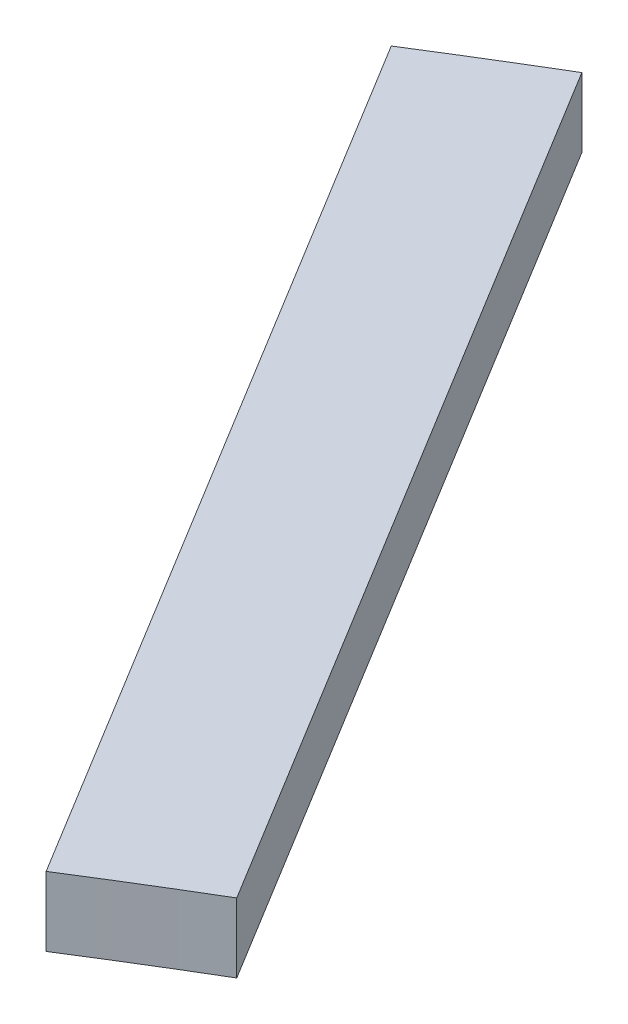
ISO-10303-21;
HEADER;
FILE_DESCRIPTION(('STEP AP214'),'2;1');
FILE_NAME('part.step','',(''),(''),'','','');
FILE_SCHEMA(('AUTOMOTIVE_DESIGN { 1 0 10303 214 1 1 1 1 }'));
ENDSEC;
DATA;
#1=APPLICATION_CONTEXT('core data for automotive mechanical design processes');
#2=APPLICATION_PROTOCOL_DEFINITION('international standard','automotive_design',2000,#1);
#3=PRODUCT_CONTEXT('',#1,'mechanical');
#4=PRODUCT('Part','Part','',(#3));
#5=PRODUCT_RELATED_PRODUCT_CATEGORY('part','',(#4));
#6=PRODUCT_DEFINITION_FORMATION('','',#4);
#7=PRODUCT_DEFINITION_CONTEXT('part definition',#1,'design');
#8=PRODUCT_DEFINITION('design','',#6,#7);
#9=PRODUCT_DEFINITION_SHAPE('','',#8);
#10=(LENGTH_UNIT() NAMED_UNIT(*) SI_UNIT(.MILLI.,.METRE.));
#11=(NAMED_UNIT(*) PLANE_ANGLE_UNIT() SI_UNIT($,.RADIAN.));
#12=(NAMED_UNIT(*) SI_UNIT($,.STERADIAN.) SOLID_ANGLE_UNIT());
#13=UNCERTAINTY_MEASURE_WITH_UNIT(LENGTH_MEASURE(1.E-05),#10,'distance_accuracy_value','');
#14=(GEOMETRIC_REPRESENTATION_CONTEXT(3) GLOBAL_UNCERTAINTY_ASSIGNED_CONTEXT((#13)) GLOBAL_UNIT_ASSIGNED_CONTEXT((#10,
#11,#12)) REPRESENTATION_CONTEXT('',''));
#15=CARTESIAN_POINT('',(0.,0.,0.));
#16=DIRECTION('',(0.,0.,1.));
#17=DIRECTION('',(1.,0.,0.));
#18=AXIS2_PLACEMENT_3D('',#15,#16,#17);
#19=CARTESIAN_POINT('',(-6.32402849270692E-13,7.62,-2.95536896665495E-13));
#20=DIRECTION('',(0.,1.,0.));
#21=DIRECTION('',(0.,0.,1.));
#22=AXIS2_PLACEMENT_3D('',#19,#20,#21);
#23=PLANE('',#22);
#24=DIRECTION('',(0.521435203379497,0.,0.853290881632156));
#25=VECTOR('',#24,1.);
#26=CARTESIAN_POINT('',(-9.16661386162984,7.62,-15.487615663904));
#27=LINE('',#26,#25);
#28=CARTESIAN_POINT('',(-11.1534452990925,7.62,-18.7389211721229));
#29=VERTEX_POINT('',#28);
#30=CARTESIAN_POINT('',(-9.16661386162982,7.62,-15.487615663904));
#31=VERTEX_POINT('',#30);
#32=EDGE_CURVE('E59',#29,#31,#27,.T.);
#33=ORIENTED_EDGE('',*,*,#32,.T.);
#34=CARTESIAN_POINT('',(-6.32402849270692E-13,7.62,-2.95536896665495E-13));
#35=DIRECTION('',(0.,1.,0.));
#36=DIRECTION('',(0.,0.,1.));
#37=AXIS2_PLACEMENT_3D('',#34,#35,#36);
#38=CIRCLE('',#37,17.9970288837076);
#39=CARTESIAN_POINT('',(-9.60008562949894,7.62,-15.2227265805872));
#40=VERTEX_POINT('',#39);
#41=EDGE_CURVE('E81',#31,#40,#38,.T.);
#42=ORIENTED_EDGE('',*,*,#41,.T.);
#43=DIRECTION('',(-0.521435203379497,0.,-0.853290881632156));
#44=VECTOR('',#43,1.);
#45=CARTESIAN_POINT('',(-9.60008562949897,7.62,-15.2227265805872));
#46=LINE('',#45,#44);
#47=CARTESIAN_POINT('',(-11.5869170669616,7.62,-18.4740320888061));
#48=VERTEX_POINT('',#47);
#49=EDGE_CURVE('E60',#40,#48,#46,.T.);
#50=ORIENTED_EDGE('',*,*,#49,.T.);
#51=CARTESIAN_POINT('',(-6.32402849270692E-13,7.62,-2.95536896665495E-13));
#52=DIRECTION('',(0.,1.,0.));
#53=DIRECTION('',(0.,0.,1.));
#54=AXIS2_PLACEMENT_3D('',#51,#52,#53);
#55=CIRCLE('',#54,21.8070288837076);
#56=EDGE_CURVE('E20',#29,#48,#55,.T.);
#57=ORIENTED_EDGE('',*,*,#56,.F.);
#58=EDGE_LOOP('',(#33,#42,#50,#57));
#59=FACE_BOUND('',#58,.T.);
#60=ADVANCED_FACE('F17',(#59),#23,.F.);
#61=CARTESIAN_POINT('',(-6.32402849270692E-13,7.874,-2.95536896665495E-13));
#62=DIRECTION('',(0.,1.,0.));
#63=DIRECTION('',(0.,0.,1.));
#64=AXIS2_PLACEMENT_3D('',#61,#62,#63);
#65=CYLINDRICAL_SURFACE('',#64,21.8070288837076);
#66=CARTESIAN_POINT('',(-6.32402849270692E-13,7.874,-2.95536896665495E-13));
#67=DIRECTION('',(0.,1.,0.));
#68=DIRECTION('',(0.,0.,1.));
#69=AXIS2_PLACEMENT_3D('',#66,#67,#68);
#70=CIRCLE('',#69,21.8070288837076);
#71=CARTESIAN_POINT('',(-11.1534452990925,7.874,-18.7389211721229));
#72=VERTEX_POINT('',#71);
#73=CARTESIAN_POINT('',(-11.5869170669617,7.874,-18.4740320888061));
#74=VERTEX_POINT('',#73);
#75=EDGE_CURVE('E68',#72,#74,#70,.T.);
#76=ORIENTED_EDGE('',*,*,#75,.F.);
#77=DIRECTION('',(0.,1.,0.));
#78=VECTOR('',#77,1.);
#79=CARTESIAN_POINT('',(-11.1534452990925,7.874,-18.7389211721229));
#80=LINE('',#79,#78);
#81=EDGE_CURVE('E65',#72,#29,#80,.F.);
#82=ORIENTED_EDGE('',*,*,#81,.T.);
#83=ORIENTED_EDGE('',*,*,#56,.T.);
#84=DIRECTION('',(0.,1.,0.));
#85=VECTOR('',#84,1.);
#86=CARTESIAN_POINT('',(-11.5869170669617,7.874,-18.4740320888061));
#87=LINE('',#86,#85);
#88=EDGE_CURVE('E63',#48,#74,#87,.T.);
#89=ORIENTED_EDGE('',*,*,#88,.T.);
#90=EDGE_LOOP('',(#76,#82,#83,#89));
#91=FACE_BOUND('',#90,.T.);
#92=ADVANCED_FACE('F66',(#91),#65,.T.);
#93=CARTESIAN_POINT('',(-9.60008562949897,7.874,-15.2227265805872));
#94=DIRECTION('',(0.853290881632156,0.,-0.521435203379497));
#95=DIRECTION('',(-0.521435203379497,0.,-0.853290881632156));
#96=AXIS2_PLACEMENT_3D('',#93,#94,#95);
#97=PLANE('',#96);
#98=DIRECTION('',(0.,1.,0.));
#99=VECTOR('',#98,1.);
#100=CARTESIAN_POINT('',(-9.60008562949894,7.874,-15.2227265805872));
#101=LINE('',#100,#99);
#102=CARTESIAN_POINT('',(-9.60008562949894,7.874,-15.2227265805872));
#103=VERTEX_POINT('',#102);
#104=EDGE_CURVE('E79',#40,#103,#101,.T.);
#105=ORIENTED_EDGE('',*,*,#104,.T.);
#106=DIRECTION('',(0.521435203379509,0.,0.853290881632149));
#107=VECTOR('',#106,1.);
#108=CARTESIAN_POINT('',(-11.5869170669617,7.874,-18.4740320888061));
#109=LINE('',#108,#107);
#110=EDGE_CURVE('E73',#74,#103,#109,.T.);
#111=ORIENTED_EDGE('',*,*,#110,.F.);
#112=ORIENTED_EDGE('',*,*,#88,.F.);
#113=ORIENTED_EDGE('',*,*,#49,.F.);
#114=EDGE_LOOP('',(#105,#111,#112,#113));
#115=FACE_BOUND('',#114,.T.);
#116=ADVANCED_FACE('F90',(#115),#97,.F.);
#117=CARTESIAN_POINT('',(-6.32402849270692E-13,7.874,-2.95536896665495E-13));
#118=DIRECTION('',(0.,1.,0.));
#119=DIRECTION('',(0.,0.,1.));
#120=AXIS2_PLACEMENT_3D('',#117,#118,#119);
#121=CYLINDRICAL_SURFACE('',#120,17.9970288837076);
#122=DIRECTION('',(0.,1.,0.));
#123=VECTOR('',#122,1.);
#124=CARTESIAN_POINT('',(-9.16661386162984,7.874,-15.487615663904));
#125=LINE('',#124,#123);
#126=CARTESIAN_POINT('',(-9.16661386162982,7.874,-15.487615663904));
#127=VERTEX_POINT('',#126);
#128=EDGE_CURVE('E35',#31,#127,#125,.T.);
#129=ORIENTED_EDGE('',*,*,#128,.T.);
#130=CARTESIAN_POINT('',(-6.32402849270692E-13,7.874,-2.95536896665495E-13));
#131=DIRECTION('',(0.,1.,0.));
#132=DIRECTION('',(0.,0.,1.));
#133=AXIS2_PLACEMENT_3D('',#130,#131,#132);
#134=CIRCLE('',#133,17.9970288837076);
#135=EDGE_CURVE('E26',#103,#127,#134,.F.);
#136=ORIENTED_EDGE('',*,*,#135,.F.);
#137=ORIENTED_EDGE('',*,*,#104,.F.);
#138=ORIENTED_EDGE('',*,*,#41,.F.);
#139=EDGE_LOOP('',(#129,#136,#137,#138));
#140=FACE_BOUND('',#139,.T.);
#141=ADVANCED_FACE('F92',(#140),#121,.F.);
#142=CARTESIAN_POINT('',(-9.16661386162984,7.874,-15.487615663904));
#143=DIRECTION('',(-0.853290881632156,0.,0.521435203379497));
#144=DIRECTION('',(0.521435203379497,0.,0.853290881632156));
#145=AXIS2_PLACEMENT_3D('',#142,#143,#144);
#146=PLANE('',#145);
#147=ORIENTED_EDGE('',*,*,#81,.F.);
#148=DIRECTION('',(-0.521435203379496,0.,-0.853290881632157));
#149=VECTOR('',#148,1.);
#150=CARTESIAN_POINT('',(-9.16661386162984,7.874,-15.487615663904));
#151=LINE('',#150,#149);
#152=EDGE_CURVE('E11',#127,#72,#151,.T.);
#153=ORIENTED_EDGE('',*,*,#152,.F.);
#154=ORIENTED_EDGE('',*,*,#128,.F.);
#155=ORIENTED_EDGE('',*,*,#32,.F.);
#156=EDGE_LOOP('',(#147,#153,#154,#155));
#157=FACE_BOUND('',#156,.T.);
#158=ADVANCED_FACE('F71',(#157),#146,.F.);
#159=CARTESIAN_POINT('',(-6.32402849270692E-13,7.874,-2.95536896665495E-13));
#160=DIRECTION('',(0.,1.,0.));
#161=DIRECTION('',(0.,0.,1.));
#162=AXIS2_PLACEMENT_3D('',#159,#160,#161);
#163=PLANE('',#162);
#164=ORIENTED_EDGE('',*,*,#135,.T.);
#165=ORIENTED_EDGE('',*,*,#152,.T.);
#166=ORIENTED_EDGE('',*,*,#75,.T.);
#167=ORIENTED_EDGE('',*,*,#110,.T.);
#168=EDGE_LOOP('',(#164,#165,#166,#167));
#169=FACE_BOUND('',#168,.T.);
#170=ADVANCED_FACE('F89',(#169),#163,.T.);
#171=CLOSED_SHELL('',(#60,#92,#116,#141,#158,#170));
#172=MANIFOLD_SOLID_BREP('B1',#171);
#173=ADVANCED_BREP_SHAPE_REPRESENTATION('',(#18,#172),#14);
#174=SHAPE_DEFINITION_REPRESENTATION(#9,#173);
ENDSEC;
END-ISO-10303-21;
